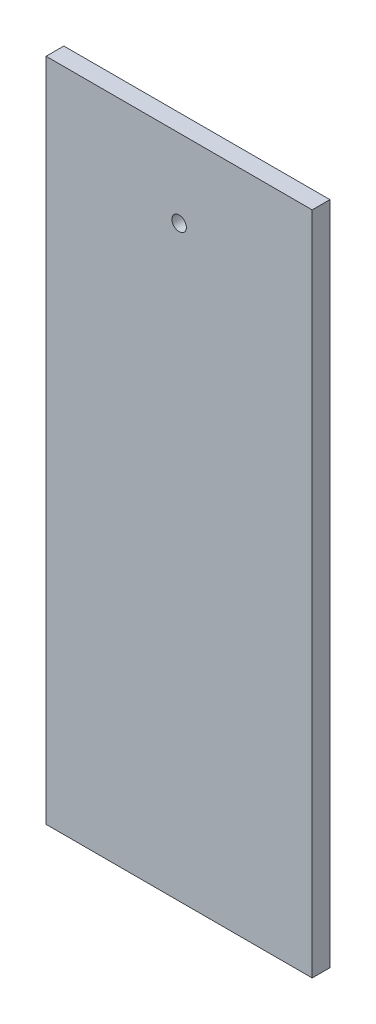
ISO-10303-21;
HEADER;
FILE_DESCRIPTION(('STEP AP214'),'2;1');
FILE_NAME('part.step','',(''),(''),'','','');
FILE_SCHEMA(('AUTOMOTIVE_DESIGN { 1 0 10303 214 1 1 1 1 }'));
ENDSEC;
DATA;
#1=APPLICATION_CONTEXT('core data for automotive mechanical design processes');
#2=APPLICATION_PROTOCOL_DEFINITION('international standard','automotive_design',2000,#1);
#3=PRODUCT_CONTEXT('',#1,'mechanical');
#4=PRODUCT('Part','Part','',(#3));
#5=PRODUCT_RELATED_PRODUCT_CATEGORY('part','',(#4));
#6=PRODUCT_DEFINITION_FORMATION('','',#4);
#7=PRODUCT_DEFINITION_CONTEXT('part definition',#1,'design');
#8=PRODUCT_DEFINITION('design','',#6,#7);
#9=PRODUCT_DEFINITION_SHAPE('','',#8);
#10=(LENGTH_UNIT() NAMED_UNIT(*) SI_UNIT(.MILLI.,.METRE.));
#11=(NAMED_UNIT(*) PLANE_ANGLE_UNIT() SI_UNIT($,.RADIAN.));
#12=(NAMED_UNIT(*) SI_UNIT($,.STERADIAN.) SOLID_ANGLE_UNIT());
#13=UNCERTAINTY_MEASURE_WITH_UNIT(LENGTH_MEASURE(1.E-05),#10,'distance_accuracy_value','');
#14=(GEOMETRIC_REPRESENTATION_CONTEXT(3) GLOBAL_UNCERTAINTY_ASSIGNED_CONTEXT((#13)) GLOBAL_UNIT_ASSIGNED_CONTEXT((#10,
#11,#12)) REPRESENTATION_CONTEXT('',''));
#15=CARTESIAN_POINT('',(0.,0.,0.));
#16=DIRECTION('',(0.,0.,1.));
#17=DIRECTION('',(1.,0.,0.));
#18=AXIS2_PLACEMENT_3D('',#15,#16,#17);
#19=CARTESIAN_POINT('',(0.,0.,2.));
#20=DIRECTION('',(0.,0.,-1.));
#21=DIRECTION('',(-1.,0.,0.));
#22=AXIS2_PLACEMENT_3D('',#19,#20,#21);
#23=PLANE('',#22);
#24=DIRECTION('',(0.,-1.,0.));
#25=VECTOR('',#24,1.);
#26=CARTESIAN_POINT('',(0.,0.,2.));
#27=LINE('',#26,#25);
#28=CARTESIAN_POINT('',(0.,75.,2.));
#29=VERTEX_POINT('',#28);
#30=CARTESIAN_POINT('',(0.,0.,2.));
#31=VERTEX_POINT('',#30);
#32=EDGE_CURVE('E91',#29,#31,#27,.T.);
#33=ORIENTED_EDGE('',*,*,#32,.T.);
#34=DIRECTION('',(1.,0.,0.));
#35=VECTOR('',#34,1.);
#36=CARTESIAN_POINT('',(0.,0.,2.));
#37=LINE('',#36,#35);
#38=CARTESIAN_POINT('',(30.,0.,2.));
#39=VERTEX_POINT('',#38);
#40=EDGE_CURVE('E86',#31,#39,#37,.T.);
#41=ORIENTED_EDGE('',*,*,#40,.T.);
#42=DIRECTION('',(0.,1.,0.));
#43=VECTOR('',#42,1.);
#44=CARTESIAN_POINT('',(30.,0.,2.));
#45=LINE('',#44,#43);
#46=CARTESIAN_POINT('',(30.,75.,2.));
#47=VERTEX_POINT('',#46);
#48=EDGE_CURVE('E89',#39,#47,#45,.T.);
#49=ORIENTED_EDGE('',*,*,#48,.T.);
#50=DIRECTION('',(-1.,0.,0.));
#51=VECTOR('',#50,1.);
#52=CARTESIAN_POINT('',(0.,75.,2.));
#53=LINE('',#52,#51);
#54=EDGE_CURVE('E56',#47,#29,#53,.T.);
#55=ORIENTED_EDGE('',*,*,#54,.T.);
#56=EDGE_LOOP('',(#33,#41,#49,#55));
#57=FACE_BOUND('',#56,.T.);
#58=CARTESIAN_POINT('',(15.,66.185,2.));
#59=DIRECTION('',(0.,0.,1.));
#60=DIRECTION('',(1.,0.,0.));
#61=AXIS2_PLACEMENT_3D('',#58,#59,#60);
#62=CIRCLE('',#61,0.815000000000006);
#63=CARTESIAN_POINT('',(15.815,66.185,2.));
#64=VERTEX_POINT('',#63);
#65=EDGE_CURVE('E106',#64,#64,#62,.T.);
#66=ORIENTED_EDGE('',*,*,#65,.F.);
#67=EDGE_LOOP('',(#66));
#68=FACE_BOUND('',#67,.T.);
#69=ADVANCED_FACE('F39',(#57,#68),#23,.F.);
#70=CARTESIAN_POINT('',(0.,0.,0.));
#71=DIRECTION('',(0.,0.,-1.));
#72=DIRECTION('',(-1.,0.,0.));
#73=AXIS2_PLACEMENT_3D('',#70,#71,#72);
#74=PLANE('',#73);
#75=DIRECTION('',(0.,-1.,0.));
#76=VECTOR('',#75,1.);
#77=CARTESIAN_POINT('',(0.,0.,0.));
#78=LINE('',#77,#76);
#79=CARTESIAN_POINT('',(0.,75.,0.));
#80=VERTEX_POINT('',#79);
#81=CARTESIAN_POINT('',(0.,0.,0.));
#82=VERTEX_POINT('',#81);
#83=EDGE_CURVE('E103',#80,#82,#78,.T.);
#84=ORIENTED_EDGE('',*,*,#83,.F.);
#85=DIRECTION('',(-1.,0.,0.));
#86=VECTOR('',#85,1.);
#87=CARTESIAN_POINT('',(0.,75.,0.));
#88=LINE('',#87,#86);
#89=CARTESIAN_POINT('',(30.,75.,0.));
#90=VERTEX_POINT('',#89);
#91=EDGE_CURVE('E79',#90,#80,#88,.T.);
#92=ORIENTED_EDGE('',*,*,#91,.F.);
#93=DIRECTION('',(0.,1.,0.));
#94=VECTOR('',#93,1.);
#95=CARTESIAN_POINT('',(30.,0.,0.));
#96=LINE('',#95,#94);
#97=CARTESIAN_POINT('',(30.,0.,0.));
#98=VERTEX_POINT('',#97);
#99=EDGE_CURVE('E73',#98,#90,#96,.T.);
#100=ORIENTED_EDGE('',*,*,#99,.F.);
#101=DIRECTION('',(1.,0.,0.));
#102=VECTOR('',#101,1.);
#103=CARTESIAN_POINT('',(0.,0.,0.));
#104=LINE('',#103,#102);
#105=EDGE_CURVE('E95',#82,#98,#104,.T.);
#106=ORIENTED_EDGE('',*,*,#105,.F.);
#107=EDGE_LOOP('',(#84,#92,#100,#106));
#108=FACE_BOUND('',#107,.T.);
#109=CARTESIAN_POINT('',(15.,66.185,0.));
#110=DIRECTION('',(0.,0.,1.));
#111=DIRECTION('',(1.,0.,0.));
#112=AXIS2_PLACEMENT_3D('',#109,#110,#111);
#113=CIRCLE('',#112,0.815000000000006);
#114=CARTESIAN_POINT('',(15.815,66.185,0.));
#115=VERTEX_POINT('',#114);
#116=EDGE_CURVE('E118',#115,#115,#113,.T.);
#117=ORIENTED_EDGE('',*,*,#116,.T.);
#118=EDGE_LOOP('',(#117));
#119=FACE_BOUND('',#118,.T.);
#120=ADVANCED_FACE('F114',(#108,#119),#74,.T.);
#121=CARTESIAN_POINT('',(0.,0.,2.));
#122=DIRECTION('',(1.,0.,0.));
#123=DIRECTION('',(0.,1.,0.));
#124=AXIS2_PLACEMENT_3D('',#121,#122,#123);
#125=PLANE('',#124);
#126=ORIENTED_EDGE('',*,*,#83,.T.);
#127=DIRECTION('',(0.,0.,-1.));
#128=VECTOR('',#127,1.);
#129=CARTESIAN_POINT('',(0.,0.,2.));
#130=LINE('',#129,#128);
#131=EDGE_CURVE('E11',#31,#82,#130,.T.);
#132=ORIENTED_EDGE('',*,*,#131,.F.);
#133=ORIENTED_EDGE('',*,*,#32,.F.);
#134=DIRECTION('',(0.,0.,-1.));
#135=VECTOR('',#134,1.);
#136=CARTESIAN_POINT('',(0.,75.,2.));
#137=LINE('',#136,#135);
#138=EDGE_CURVE('E99',#29,#80,#137,.T.);
#139=ORIENTED_EDGE('',*,*,#138,.T.);
#140=EDGE_LOOP('',(#126,#132,#133,#139));
#141=FACE_BOUND('',#140,.T.);
#142=ADVANCED_FACE('F41',(#141),#125,.F.);
#143=CARTESIAN_POINT('',(0.,0.,2.));
#144=DIRECTION('',(0.,1.,0.));
#145=DIRECTION('',(0.,0.,1.));
#146=AXIS2_PLACEMENT_3D('',#143,#144,#145);
#147=PLANE('',#146);
#148=ORIENTED_EDGE('',*,*,#105,.T.);
#149=DIRECTION('',(0.,0.,-1.));
#150=VECTOR('',#149,1.);
#151=CARTESIAN_POINT('',(30.,0.,2.));
#152=LINE('',#151,#150);
#153=EDGE_CURVE('E48',#39,#98,#152,.T.);
#154=ORIENTED_EDGE('',*,*,#153,.F.);
#155=ORIENTED_EDGE('',*,*,#40,.F.);
#156=ORIENTED_EDGE('',*,*,#131,.T.);
#157=EDGE_LOOP('',(#148,#154,#155,#156));
#158=FACE_BOUND('',#157,.T.);
#159=ADVANCED_FACE('F94',(#158),#147,.F.);
#160=CARTESIAN_POINT('',(30.,0.,2.));
#161=DIRECTION('',(-1.,0.,0.));
#162=DIRECTION('',(0.,0.,1.));
#163=AXIS2_PLACEMENT_3D('',#160,#161,#162);
#164=PLANE('',#163);
#165=ORIENTED_EDGE('',*,*,#99,.T.);
#166=DIRECTION('',(0.,0.,-1.));
#167=VECTOR('',#166,1.);
#168=CARTESIAN_POINT('',(30.,75.,2.));
#169=LINE('',#168,#167);
#170=EDGE_CURVE('E96',#47,#90,#169,.T.);
#171=ORIENTED_EDGE('',*,*,#170,.F.);
#172=ORIENTED_EDGE('',*,*,#48,.F.);
#173=ORIENTED_EDGE('',*,*,#153,.T.);
#174=EDGE_LOOP('',(#165,#171,#172,#173));
#175=FACE_BOUND('',#174,.T.);
#176=ADVANCED_FACE('F97',(#175),#164,.F.);
#177=CARTESIAN_POINT('',(0.,75.,2.));
#178=DIRECTION('',(0.,-1.,0.));
#179=DIRECTION('',(0.,0.,-1.));
#180=AXIS2_PLACEMENT_3D('',#177,#178,#179);
#181=PLANE('',#180);
#182=ORIENTED_EDGE('',*,*,#91,.T.);
#183=ORIENTED_EDGE('',*,*,#138,.F.);
#184=ORIENTED_EDGE('',*,*,#54,.F.);
#185=ORIENTED_EDGE('',*,*,#170,.T.);
#186=EDGE_LOOP('',(#182,#183,#184,#185));
#187=FACE_BOUND('',#186,.T.);
#188=ADVANCED_FACE('F111',(#187),#181,.F.);
#189=CARTESIAN_POINT('',(15.,66.185,2.));
#190=DIRECTION('',(0.,0.,-1.));
#191=DIRECTION('',(-1.,0.,0.));
#192=AXIS2_PLACEMENT_3D('',#189,#190,#191);
#193=CYLINDRICAL_SURFACE('',#192,0.815000000000006);
#194=ORIENTED_EDGE('',*,*,#65,.T.);
#195=EDGE_LOOP('',(#194));
#196=FACE_BOUND('',#195,.T.);
#197=ORIENTED_EDGE('',*,*,#116,.F.);
#198=EDGE_LOOP('',(#197));
#199=FACE_BOUND('',#198,.T.);
#200=ADVANCED_FACE('F124',(#196,#199),#193,.F.);
#201=CLOSED_SHELL('',(#69,#120,#142,#159,#176,#188,#200));
#202=MANIFOLD_SOLID_BREP('B2',#201);
#203=ADVANCED_BREP_SHAPE_REPRESENTATION('',(#18,#202),#14);
#204=SHAPE_DEFINITION_REPRESENTATION(#9,#203);
ENDSEC;
END-ISO-10303-21;
